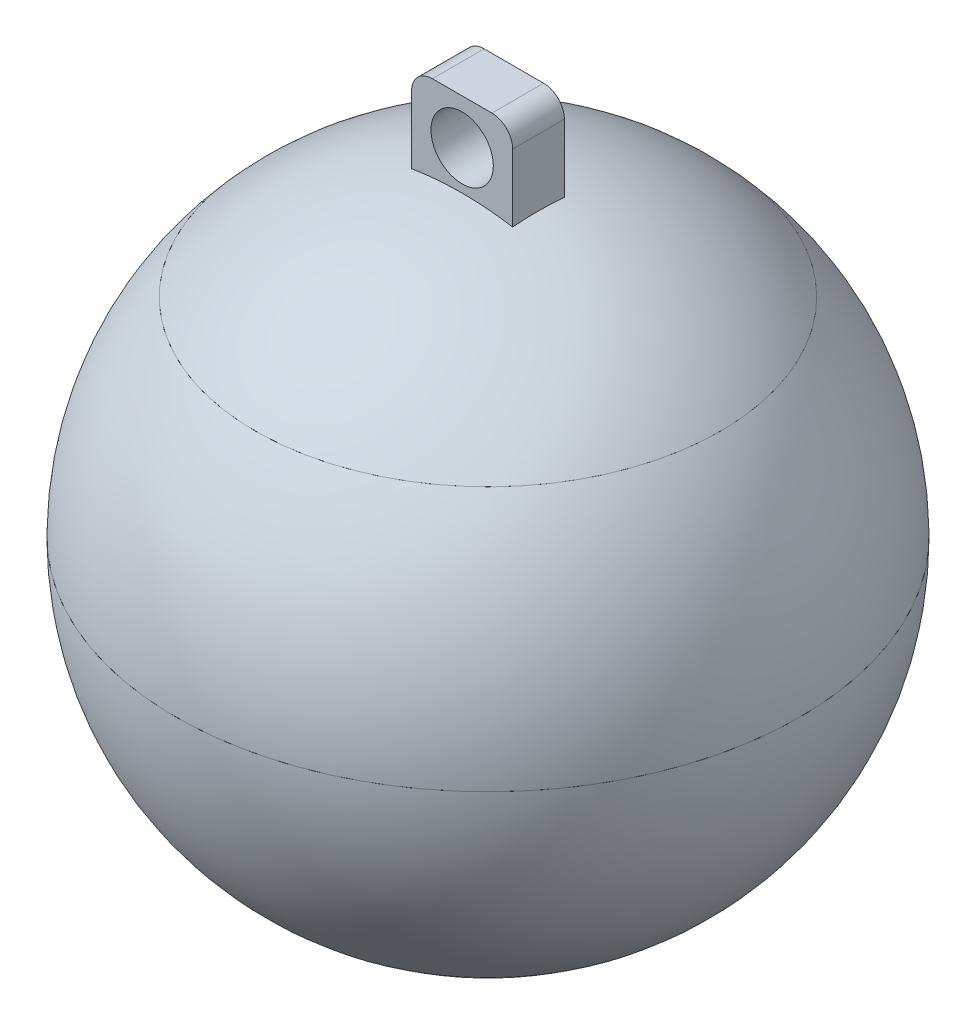
ISO-10303-21;
HEADER;
FILE_DESCRIPTION(('STEP AP214'),'2;1');
FILE_NAME('part.step','',(''),(''),'','','');
FILE_SCHEMA(('AUTOMOTIVE_DESIGN { 1 0 10303 214 1 1 1 1 }'));
ENDSEC;
DATA;
#1=APPLICATION_CONTEXT('core data for automotive mechanical design processes');
#2=APPLICATION_PROTOCOL_DEFINITION('international standard','automotive_design',2000,#1);
#3=PRODUCT_CONTEXT('',#1,'mechanical');
#4=PRODUCT('Part','Part','',(#3));
#5=PRODUCT_RELATED_PRODUCT_CATEGORY('part','',(#4));
#6=PRODUCT_DEFINITION_FORMATION('','',#4);
#7=PRODUCT_DEFINITION_CONTEXT('part definition',#1,'design');
#8=PRODUCT_DEFINITION('design','',#6,#7);
#9=PRODUCT_DEFINITION_SHAPE('','',#8);
#10=(LENGTH_UNIT() NAMED_UNIT(*) SI_UNIT(.MILLI.,.METRE.));
#11=(NAMED_UNIT(*) PLANE_ANGLE_UNIT() SI_UNIT($,.RADIAN.));
#12=(NAMED_UNIT(*) SI_UNIT($,.STERADIAN.) SOLID_ANGLE_UNIT());
#13=UNCERTAINTY_MEASURE_WITH_UNIT(LENGTH_MEASURE(1.E-05),#10,'distance_accuracy_value','');
#14=(GEOMETRIC_REPRESENTATION_CONTEXT(3) GLOBAL_UNCERTAINTY_ASSIGNED_CONTEXT((#13)) GLOBAL_UNIT_ASSIGNED_CONTEXT((#10,
#11,#12)) REPRESENTATION_CONTEXT('',''));
#15=CARTESIAN_POINT('',(0.,0.,0.));
#16=DIRECTION('',(0.,0.,1.));
#17=DIRECTION('',(1.,0.,0.));
#18=AXIS2_PLACEMENT_3D('',#15,#16,#17);
#19=CARTESIAN_POINT('',(0.,10.,0.));
#20=DIRECTION('',(0.,1.,0.));
#21=DIRECTION('',(0.,0.,1.));
#22=AXIS2_PLACEMENT_3D('',#19,#20,#21);
#23=PLANE('',#22);
#24=CARTESIAN_POINT('',(0.,10.,0.));
#25=DIRECTION('',(0.,-1.,0.));
#26=DIRECTION('',(0.,0.,-1.));
#27=AXIS2_PLACEMENT_3D('',#24,#25,#26);
#28=CIRCLE('',#27,11.180339887499);
#29=CARTESIAN_POINT('',(0.,10.,-11.180339887499));
#30=VERTEX_POINT('',#29);
#31=EDGE_CURVE('E118',#30,#30,#28,.T.);
#32=ORIENTED_EDGE('',*,*,#31,.T.);
#33=EDGE_LOOP('',(#32));
#34=FACE_BOUND('',#33,.T.);
#35=ADVANCED_FACE('F50',(#34),#23,.F.);
#36=CARTESIAN_POINT('',(0.,0.,0.));
#37=DIRECTION('',(0.,-1.,0.));
#38=DIRECTION('',(-1.,0.,0.));
#39=AXIS2_PLACEMENT_3D('',#36,#37,#38);
#40=SPHERICAL_SURFACE('',#39,15.);
#41=CARTESIAN_POINT('',(0.,0.,-1.24356422731036));
#42=DIRECTION('',(0.,0.,-1.));
#43=DIRECTION('',(-1.,0.,0.));
#44=AXIS2_PLACEMENT_3D('',#41,#42,#43);
#45=CIRCLE('',#44,14.9483627201294);
#46=CARTESIAN_POINT('',(-2.43060280792479,14.7494311077635,-1.24356422731036));
#47=VERTEX_POINT('',#46);
#48=CARTESIAN_POINT('',(2.43060280792479,14.7494311077635,-1.24356422731036));
#49=VERTEX_POINT('',#48);
#50=EDGE_CURVE('E106',#47,#49,#45,.T.);
#51=ORIENTED_EDGE('',*,*,#50,.T.);
#52=CARTESIAN_POINT('',(2.43060280792479,0.,0.));
#53=DIRECTION('',(1.,0.,0.));
#54=DIRECTION('',(0.,0.,-1.));
#55=AXIS2_PLACEMENT_3D('',#52,#53,#54);
#56=CIRCLE('',#55,14.8017623947322);
#57=CARTESIAN_POINT('',(2.43060280792479,14.7494311077635,1.24356422731036));
#58=VERTEX_POINT('',#57);
#59=EDGE_CURVE('E130',#49,#58,#56,.T.);
#60=ORIENTED_EDGE('',*,*,#59,.T.);
#61=CARTESIAN_POINT('',(0.,0.,1.24356422731036));
#62=DIRECTION('',(0.,0.,1.));
#63=DIRECTION('',(1.,0.,0.));
#64=AXIS2_PLACEMENT_3D('',#61,#62,#63);
#65=CIRCLE('',#64,14.9483627201294);
#66=CARTESIAN_POINT('',(-2.43060280792479,14.7494311077635,1.24356422731036));
#67=VERTEX_POINT('',#66);
#68=EDGE_CURVE('E128',#58,#67,#65,.T.);
#69=ORIENTED_EDGE('',*,*,#68,.T.);
#70=CARTESIAN_POINT('',(-2.43060280792479,0.,0.));
#71=DIRECTION('',(-1.,0.,0.));
#72=DIRECTION('',(0.,0.,1.));
#73=AXIS2_PLACEMENT_3D('',#70,#71,#72);
#74=CIRCLE('',#73,14.8017623947322);
#75=EDGE_CURVE('E117',#67,#47,#74,.T.);
#76=ORIENTED_EDGE('',*,*,#75,.T.);
#77=EDGE_LOOP('',(#51,#60,#69,#76));
#78=FACE_BOUND('',#77,.T.);
#79=ORIENTED_EDGE('',*,*,#31,.F.);
#80=EDGE_LOOP('',(#79));
#81=FACE_BOUND('',#80,.T.);
#82=ADVANCED_FACE('F126',(#78,#81),#40,.T.);
#83=CARTESIAN_POINT('',(2.43060280792479,14.,-1.24356422731036));
#84=DIRECTION('',(1.,0.,0.));
#85=DIRECTION('',(0.,0.,-1.));
#86=AXIS2_PLACEMENT_3D('',#83,#84,#85);
#87=PLANE('',#86);
#88=DIRECTION('',(0.,1.,0.));
#89=VECTOR('',#88,1.);
#90=CARTESIAN_POINT('',(2.43060280792479,14.,-1.24356422731036));
#91=LINE('',#90,#89);
#92=CARTESIAN_POINT('',(2.43060280792479,18.,-1.24356422731036));
#93=VERTEX_POINT('',#92);
#94=EDGE_CURVE('E112',#49,#93,#91,.T.);
#95=ORIENTED_EDGE('',*,*,#94,.T.);
#96=DIRECTION('',(0.,0.,-1.));
#97=VECTOR('',#96,1.);
#98=CARTESIAN_POINT('',(2.43060280792479,18.,-1.24356422731036));
#99=LINE('',#98,#97);
#100=CARTESIAN_POINT('',(2.43060280792479,18.,1.24356422731036));
#101=VERTEX_POINT('',#100);
#102=EDGE_CURVE('E74',#93,#101,#99,.F.);
#103=ORIENTED_EDGE('',*,*,#102,.T.);
#104=DIRECTION('',(0.,1.,0.));
#105=VECTOR('',#104,1.);
#106=CARTESIAN_POINT('',(2.43060280792479,14.,1.24356422731036));
#107=LINE('',#106,#105);
#108=EDGE_CURVE('E151',#58,#101,#107,.T.);
#109=ORIENTED_EDGE('',*,*,#108,.F.);
#110=ORIENTED_EDGE('',*,*,#59,.F.);
#111=EDGE_LOOP('',(#95,#103,#109,#110));
#112=FACE_BOUND('',#111,.T.);
#113=ADVANCED_FACE('F161',(#112),#87,.T.);
#114=CARTESIAN_POINT('',(-2.43060280792479,14.,1.24356422731036));
#115=DIRECTION('',(0.,0.,1.));
#116=DIRECTION('',(1.,0.,0.));
#117=AXIS2_PLACEMENT_3D('',#114,#115,#116);
#118=PLANE('',#117);
#119=CARTESIAN_POINT('',(0.,16.8335135997744,1.24356422731036));
#120=DIRECTION('',(0.,0.,1.));
#121=DIRECTION('',(1.,0.,0.));
#122=AXIS2_PLACEMENT_3D('',#119,#120,#121);
#123=CIRCLE('',#122,1.5);
#124=CARTESIAN_POINT('',(1.5,16.8335135997744,1.24356422731036));
#125=VERTEX_POINT('',#124);
#126=EDGE_CURVE('E170',#125,#125,#123,.T.);
#127=ORIENTED_EDGE('',*,*,#126,.F.);
#128=EDGE_LOOP('',(#127));
#129=FACE_BOUND('',#128,.T.);
#130=ORIENTED_EDGE('',*,*,#108,.T.);
#131=CARTESIAN_POINT('',(1.43060280792479,18.,1.24356422731036));
#132=DIRECTION('',(0.,0.,1.));
#133=DIRECTION('',(1.,0.,0.));
#134=AXIS2_PLACEMENT_3D('',#131,#132,#133);
#135=CIRCLE('',#134,1.);
#136=CARTESIAN_POINT('',(1.43060280792479,19.,1.24356422731036));
#137=VERTEX_POINT('',#136);
#138=EDGE_CURVE('E59',#101,#137,#135,.T.);
#139=ORIENTED_EDGE('',*,*,#138,.T.);
#140=DIRECTION('',(1.,0.,0.));
#141=VECTOR('',#140,1.);
#142=CARTESIAN_POINT('',(-2.43060280792479,19.,1.24356422731036));
#143=LINE('',#142,#141);
#144=CARTESIAN_POINT('',(-1.43060280792479,19.,1.24356422731036));
#145=VERTEX_POINT('',#144);
#146=EDGE_CURVE('E150',#145,#137,#143,.T.);
#147=ORIENTED_EDGE('',*,*,#146,.F.);
#148=CARTESIAN_POINT('',(-1.43060280792479,18.,1.24356422731036));
#149=DIRECTION('',(0.,0.,1.));
#150=DIRECTION('',(1.,0.,0.));
#151=AXIS2_PLACEMENT_3D('',#148,#149,#150);
#152=CIRCLE('',#151,1.);
#153=CARTESIAN_POINT('',(-2.43060280792479,18.,1.24356422731036));
#154=VERTEX_POINT('',#153);
#155=EDGE_CURVE('E66',#145,#154,#152,.T.);
#156=ORIENTED_EDGE('',*,*,#155,.T.);
#157=DIRECTION('',(0.,1.,0.));
#158=VECTOR('',#157,1.);
#159=CARTESIAN_POINT('',(-2.43060280792479,14.,1.24356422731036));
#160=LINE('',#159,#158);
#161=EDGE_CURVE('E123',#67,#154,#160,.T.);
#162=ORIENTED_EDGE('',*,*,#161,.F.);
#163=ORIENTED_EDGE('',*,*,#68,.F.);
#164=EDGE_LOOP('',(#130,#139,#147,#156,#162,#163));
#165=FACE_BOUND('',#164,.T.);
#166=ADVANCED_FACE('F149',(#129,#165),#118,.T.);
#167=CARTESIAN_POINT('',(-2.43060280792479,14.,-1.24356422731036));
#168=DIRECTION('',(-1.,0.,0.));
#169=DIRECTION('',(0.,0.,1.));
#170=AXIS2_PLACEMENT_3D('',#167,#168,#169);
#171=PLANE('',#170);
#172=ORIENTED_EDGE('',*,*,#161,.T.);
#173=DIRECTION('',(0.,0.,1.));
#174=VECTOR('',#173,1.);
#175=CARTESIAN_POINT('',(-2.43060280792479,18.,-1.24356422731036));
#176=LINE('',#175,#174);
#177=CARTESIAN_POINT('',(-2.43060280792479,18.,-1.24356422731036));
#178=VERTEX_POINT('',#177);
#179=EDGE_CURVE('E12',#154,#178,#176,.F.);
#180=ORIENTED_EDGE('',*,*,#179,.T.);
#181=DIRECTION('',(0.,1.,0.));
#182=VECTOR('',#181,1.);
#183=CARTESIAN_POINT('',(-2.43060280792479,14.,-1.24356422731036));
#184=LINE('',#183,#182);
#185=EDGE_CURVE('E110',#47,#178,#184,.T.);
#186=ORIENTED_EDGE('',*,*,#185,.F.);
#187=ORIENTED_EDGE('',*,*,#75,.F.);
#188=EDGE_LOOP('',(#172,#180,#186,#187));
#189=FACE_BOUND('',#188,.T.);
#190=ADVANCED_FACE('F121',(#189),#171,.T.);
#191=CARTESIAN_POINT('',(-2.43060280792479,14.,-1.24356422731036));
#192=DIRECTION('',(0.,0.,-1.));
#193=DIRECTION('',(-1.,0.,0.));
#194=AXIS2_PLACEMENT_3D('',#191,#192,#193);
#195=PLANE('',#194);
#196=CARTESIAN_POINT('',(0.,16.8335135997744,-1.24356422731036));
#197=DIRECTION('',(0.,0.,-1.));
#198=DIRECTION('',(-1.,0.,0.));
#199=AXIS2_PLACEMENT_3D('',#196,#197,#198);
#200=CIRCLE('',#199,1.5);
#201=CARTESIAN_POINT('',(-1.5,16.8335135997744,-1.24356422731036));
#202=VERTEX_POINT('',#201);
#203=EDGE_CURVE('E54',#202,#202,#200,.T.);
#204=ORIENTED_EDGE('',*,*,#203,.F.);
#205=EDGE_LOOP('',(#204));
#206=FACE_BOUND('',#205,.T.);
#207=DIRECTION('',(-1.,0.,0.));
#208=VECTOR('',#207,1.);
#209=CARTESIAN_POINT('',(-2.43060280792479,19.,-1.24356422731036));
#210=LINE('',#209,#208);
#211=CARTESIAN_POINT('',(1.43060280792479,19.,-1.24356422731036));
#212=VERTEX_POINT('',#211);
#213=CARTESIAN_POINT('',(-1.43060280792479,19.,-1.24356422731036));
#214=VERTEX_POINT('',#213);
#215=EDGE_CURVE('E158',#212,#214,#210,.T.);
#216=ORIENTED_EDGE('',*,*,#215,.F.);
#217=CARTESIAN_POINT('',(1.43060280792479,18.,-1.24356422731036));
#218=DIRECTION('',(0.,0.,-1.));
#219=DIRECTION('',(-1.,0.,0.));
#220=AXIS2_PLACEMENT_3D('',#217,#218,#219);
#221=CIRCLE('',#220,1.);
#222=EDGE_CURVE('E143',#212,#93,#221,.T.);
#223=ORIENTED_EDGE('',*,*,#222,.T.);
#224=ORIENTED_EDGE('',*,*,#94,.F.);
#225=ORIENTED_EDGE('',*,*,#50,.F.);
#226=ORIENTED_EDGE('',*,*,#185,.T.);
#227=CARTESIAN_POINT('',(-1.43060280792479,18.,-1.24356422731036));
#228=DIRECTION('',(0.,0.,-1.));
#229=DIRECTION('',(-1.,0.,0.));
#230=AXIS2_PLACEMENT_3D('',#227,#228,#229);
#231=CIRCLE('',#230,1.);
#232=EDGE_CURVE('E141',#178,#214,#231,.T.);
#233=ORIENTED_EDGE('',*,*,#232,.T.);
#234=EDGE_LOOP('',(#216,#223,#224,#225,#226,#233));
#235=FACE_BOUND('',#234,.T.);
#236=ADVANCED_FACE('F109',(#206,#235),#195,.T.);
#237=CARTESIAN_POINT('',(0.,19.,0.));
#238=DIRECTION('',(0.,1.,0.));
#239=DIRECTION('',(0.,0.,1.));
#240=AXIS2_PLACEMENT_3D('',#237,#238,#239);
#241=PLANE('',#240);
#242=ORIENTED_EDGE('',*,*,#146,.T.);
#243=DIRECTION('',(0.,0.,-1.));
#244=VECTOR('',#243,1.);
#245=CARTESIAN_POINT('',(1.43060280792479,19.,0.));
#246=LINE('',#245,#244);
#247=EDGE_CURVE('E138',#137,#212,#246,.T.);
#248=ORIENTED_EDGE('',*,*,#247,.T.);
#249=ORIENTED_EDGE('',*,*,#215,.T.);
#250=DIRECTION('',(0.,0.,1.));
#251=VECTOR('',#250,1.);
#252=CARTESIAN_POINT('',(-1.43060280792479,19.,0.));
#253=LINE('',#252,#251);
#254=EDGE_CURVE('E135',#214,#145,#253,.T.);
#255=ORIENTED_EDGE('',*,*,#254,.T.);
#256=EDGE_LOOP('',(#242,#248,#249,#255));
#257=FACE_BOUND('',#256,.T.);
#258=ADVANCED_FACE('F155',(#257),#241,.T.);
#259=CARTESIAN_POINT('',(1.43060280792479,18.,0.));
#260=DIRECTION('',(0.,0.,-1.));
#261=DIRECTION('',(-1.,0.,0.));
#262=AXIS2_PLACEMENT_3D('',#259,#260,#261);
#263=CYLINDRICAL_SURFACE('',#262,1.);
#264=ORIENTED_EDGE('',*,*,#138,.F.);
#265=ORIENTED_EDGE('',*,*,#102,.F.);
#266=ORIENTED_EDGE('',*,*,#222,.F.);
#267=ORIENTED_EDGE('',*,*,#247,.F.);
#268=EDGE_LOOP('',(#264,#265,#266,#267));
#269=FACE_BOUND('',#268,.T.);
#270=ADVANCED_FACE('F160',(#269),#263,.T.);
#271=CARTESIAN_POINT('',(-1.43060280792479,18.,0.));
#272=DIRECTION('',(0.,0.,1.));
#273=DIRECTION('',(1.,0.,0.));
#274=AXIS2_PLACEMENT_3D('',#271,#272,#273);
#275=CYLINDRICAL_SURFACE('',#274,1.);
#276=ORIENTED_EDGE('',*,*,#232,.F.);
#277=ORIENTED_EDGE('',*,*,#179,.F.);
#278=ORIENTED_EDGE('',*,*,#155,.F.);
#279=ORIENTED_EDGE('',*,*,#254,.F.);
#280=EDGE_LOOP('',(#276,#277,#278,#279));
#281=FACE_BOUND('',#280,.T.);
#282=ADVANCED_FACE('F52',(#281),#275,.T.);
#283=CARTESIAN_POINT('',(0.,16.8335135997744,-3.75643577268964));
#284=DIRECTION('',(0.,0.,1.));
#285=DIRECTION('',(1.,0.,0.));
#286=AXIS2_PLACEMENT_3D('',#283,#284,#285);
#287=CYLINDRICAL_SURFACE('',#286,1.5);
#288=ORIENTED_EDGE('',*,*,#203,.T.);
#289=EDGE_LOOP('',(#288));
#290=FACE_BOUND('',#289,.T.);
#291=ORIENTED_EDGE('',*,*,#126,.T.);
#292=EDGE_LOOP('',(#291));
#293=FACE_BOUND('',#292,.T.);
#294=ADVANCED_FACE('F177',(#290,#293),#287,.F.);
#295=CLOSED_SHELL('',(#35,#82,#113,#166,#190,#236,#258,#270,#282,#294));
#296=MANIFOLD_SOLID_BREP('B2',#295);
#297=CARTESIAN_POINT('',(0.,10.,0.));
#298=DIRECTION('',(0.,-1.,0.));
#299=DIRECTION('',(0.,0.,-1.));
#300=AXIS2_PLACEMENT_3D('',#297,#298,#299);
#301=PLANE('',#300);
#302=CARTESIAN_POINT('',(0.,10.,0.));
#303=DIRECTION('',(0.,-1.,0.));
#304=DIRECTION('',(0.,0.,-1.));
#305=AXIS2_PLACEMENT_3D('',#302,#303,#304);
#306=CIRCLE('',#305,11.180339887499);
#307=CARTESIAN_POINT('',(0.,10.,-11.180339887499));
#308=VERTEX_POINT('',#307);
#309=EDGE_CURVE('E49',#308,#308,#306,.T.);
#310=ORIENTED_EDGE('',*,*,#309,.F.);
#311=EDGE_LOOP('',(#310));
#312=FACE_BOUND('',#311,.T.);
#313=ADVANCED_FACE('F269',(#312),#301,.F.);
#314=CARTESIAN_POINT('',(0.,0.,0.));
#315=DIRECTION('',(0.,-1.,0.));
#316=DIRECTION('',(-1.,0.,0.));
#317=AXIS2_PLACEMENT_3D('',#314,#315,#316);
#318=SPHERICAL_SURFACE('',#317,15.);
#319=CARTESIAN_POINT('',(0.,0.,0.));
#320=DIRECTION('',(0.,-1.,0.));
#321=DIRECTION('',(0.,0.,-1.));
#322=AXIS2_PLACEMENT_3D('',#319,#320,#321);
#323=CIRCLE('',#322,15.);
#324=CARTESIAN_POINT('',(0.,0.,-15.));
#325=VERTEX_POINT('',#324);
#326=EDGE_CURVE('E275',#325,#325,#323,.T.);
#327=ORIENTED_EDGE('',*,*,#326,.F.);
#328=EDGE_LOOP('',(#327));
#329=FACE_BOUND('',#328,.T.);
#330=ORIENTED_EDGE('',*,*,#309,.T.);
#331=EDGE_LOOP('',(#330));
#332=FACE_BOUND('',#331,.T.);
#333=ADVANCED_FACE('F283',(#329,#332),#318,.T.);
#334=CARTESIAN_POINT('',(-15.,0.,0.));
#335=DIRECTION('',(0.,1.,0.));
#336=DIRECTION('',(0.,0.,1.));
#337=AXIS2_PLACEMENT_3D('',#334,#335,#336);
#338=PLANE('',#337);
#339=ORIENTED_EDGE('',*,*,#326,.T.);
#340=EDGE_LOOP('',(#339));
#341=FACE_BOUND('',#340,.T.);
#342=ADVANCED_FACE('F281',(#341),#338,.F.);
#343=CLOSED_SHELL('',(#313,#333,#342));
#344=MANIFOLD_SOLID_BREP('B6',#343);
#345=CARTESIAN_POINT('',(0.,0.,0.));
#346=DIRECTION('',(0.,1.,0.));
#347=DIRECTION('',(0.,0.,1.));
#348=AXIS2_PLACEMENT_3D('',#345,#346,#347);
#349=PLANE('',#348);
#350=CARTESIAN_POINT('',(0.,0.,0.));
#351=DIRECTION('',(0.,1.,0.));
#352=DIRECTION('',(0.,0.,1.));
#353=AXIS2_PLACEMENT_3D('',#350,#351,#352);
#354=CIRCLE('',#353,15.);
#355=CARTESIAN_POINT('',(0.,0.,15.));
#356=VERTEX_POINT('',#355);
#357=EDGE_CURVE('E268',#356,#356,#354,.T.);
#358=ORIENTED_EDGE('',*,*,#357,.T.);
#359=EDGE_LOOP('',(#358));
#360=FACE_BOUND('',#359,.T.);
#361=ADVANCED_FACE('F310',(#360),#349,.T.);
#362=CARTESIAN_POINT('',(0.,0.,0.));
#363=DIRECTION('',(0.,1.,0.));
#364=DIRECTION('',(-1.,0.,0.));
#365=AXIS2_PLACEMENT_3D('',#362,#363,#364);
#366=SPHERICAL_SURFACE('',#365,15.);
#367=ORIENTED_EDGE('',*,*,#357,.F.);
#368=EDGE_LOOP('',(#367));
#369=FACE_BOUND('',#368,.T.);
#370=ADVANCED_FACE('F319',(#369),#366,.T.);
#371=CLOSED_SHELL('',(#361,#370));
#372=MANIFOLD_SOLID_BREP('B44',#371);
#373=ADVANCED_BREP_SHAPE_REPRESENTATION('',(#18,#296,#344,#372),#14);
#374=SHAPE_DEFINITION_REPRESENTATION(#9,#373);
ENDSEC;
END-ISO-10303-21;
